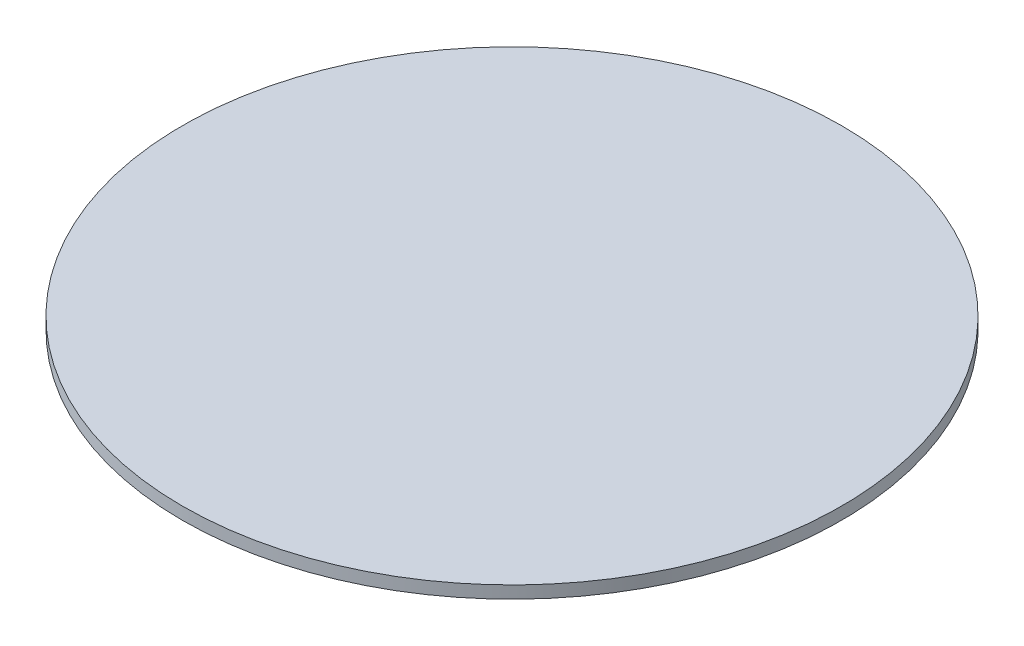
ISO-10303-21;
HEADER;
FILE_DESCRIPTION(('STEP AP214'),'2;1');
FILE_NAME('part.step','',(''),(''),'','','');
FILE_SCHEMA(('AUTOMOTIVE_DESIGN { 1 0 10303 214 1 1 1 1 }'));
ENDSEC;
DATA;
#1=APPLICATION_CONTEXT('core data for automotive mechanical design processes');
#2=APPLICATION_PROTOCOL_DEFINITION('international standard','automotive_design',2000,#1);
#3=PRODUCT_CONTEXT('',#1,'mechanical');
#4=PRODUCT('Part','Part','',(#3));
#5=PRODUCT_RELATED_PRODUCT_CATEGORY('part','',(#4));
#6=PRODUCT_DEFINITION_FORMATION('','',#4);
#7=PRODUCT_DEFINITION_CONTEXT('part definition',#1,'design');
#8=PRODUCT_DEFINITION('design','',#6,#7);
#9=PRODUCT_DEFINITION_SHAPE('','',#8);
#10=(LENGTH_UNIT() NAMED_UNIT(*) SI_UNIT(.MILLI.,.METRE.));
#11=(NAMED_UNIT(*) PLANE_ANGLE_UNIT() SI_UNIT($,.RADIAN.));
#12=(NAMED_UNIT(*) SI_UNIT($,.STERADIAN.) SOLID_ANGLE_UNIT());
#13=UNCERTAINTY_MEASURE_WITH_UNIT(LENGTH_MEASURE(1.E-05),#10,'distance_accuracy_value','');
#14=(GEOMETRIC_REPRESENTATION_CONTEXT(3) GLOBAL_UNCERTAINTY_ASSIGNED_CONTEXT((#13)) GLOBAL_UNIT_ASSIGNED_CONTEXT((#10,
#11,#12)) REPRESENTATION_CONTEXT('',''));
#15=CARTESIAN_POINT('',(0.,0.,0.));
#16=DIRECTION('',(0.,0.,1.));
#17=DIRECTION('',(1.,0.,0.));
#18=AXIS2_PLACEMENT_3D('',#15,#16,#17);
#19=CARTESIAN_POINT('',(0.,6.,0.));
#20=DIRECTION('',(0.,-1.,0.));
#21=DIRECTION('',(0.,0.,-1.));
#22=AXIS2_PLACEMENT_3D('',#19,#20,#21);
#23=CYLINDRICAL_SURFACE('',#22,160.);
#24=CARTESIAN_POINT('',(0.,6.,0.));
#25=DIRECTION('',(0.,1.,0.));
#26=DIRECTION('',(0.,0.,1.));
#27=AXIS2_PLACEMENT_3D('',#24,#25,#26);
#28=CIRCLE('',#27,160.);
#29=CARTESIAN_POINT('',(0.,6.,160.));
#30=VERTEX_POINT('',#29);
#31=EDGE_CURVE('E10',#30,#30,#28,.T.);
#32=ORIENTED_EDGE('',*,*,#31,.F.);
#33=EDGE_LOOP('',(#32));
#34=FACE_BOUND('',#33,.T.);
#35=CARTESIAN_POINT('',(0.,0.,0.));
#36=DIRECTION('',(0.,1.,0.));
#37=DIRECTION('',(0.,0.,1.));
#38=AXIS2_PLACEMENT_3D('',#35,#36,#37);
#39=CIRCLE('',#38,160.);
#40=CARTESIAN_POINT('',(0.,0.,160.));
#41=VERTEX_POINT('',#40);
#42=EDGE_CURVE('E40',#41,#41,#39,.T.);
#43=ORIENTED_EDGE('',*,*,#42,.T.);
#44=EDGE_LOOP('',(#43));
#45=FACE_BOUND('',#44,.T.);
#46=ADVANCED_FACE('F37',(#34,#45),#23,.T.);
#47=CARTESIAN_POINT('',(0.,6.,0.));
#48=DIRECTION('',(0.,1.,0.));
#49=DIRECTION('',(0.,0.,1.));
#50=AXIS2_PLACEMENT_3D('',#47,#48,#49);
#51=PLANE('',#50);
#52=ORIENTED_EDGE('',*,*,#31,.T.);
#53=EDGE_LOOP('',(#52));
#54=FACE_BOUND('',#53,.T.);
#55=ADVANCED_FACE('F52',(#54),#51,.T.);
#56=CARTESIAN_POINT('',(0.,0.,0.));
#57=DIRECTION('',(0.,1.,0.));
#58=DIRECTION('',(0.,0.,1.));
#59=AXIS2_PLACEMENT_3D('',#56,#57,#58);
#60=PLANE('',#59);
#61=ORIENTED_EDGE('',*,*,#42,.F.);
#62=EDGE_LOOP('',(#61));
#63=FACE_BOUND('',#62,.T.);
#64=ADVANCED_FACE('F50',(#63),#60,.F.);
#65=CLOSED_SHELL('',(#46,#55,#64));
#66=MANIFOLD_SOLID_BREP('B2',#65);
#67=ADVANCED_BREP_SHAPE_REPRESENTATION('',(#18,#66),#14);
#68=SHAPE_DEFINITION_REPRESENTATION(#9,#67);
ENDSEC;
END-ISO-10303-21;
